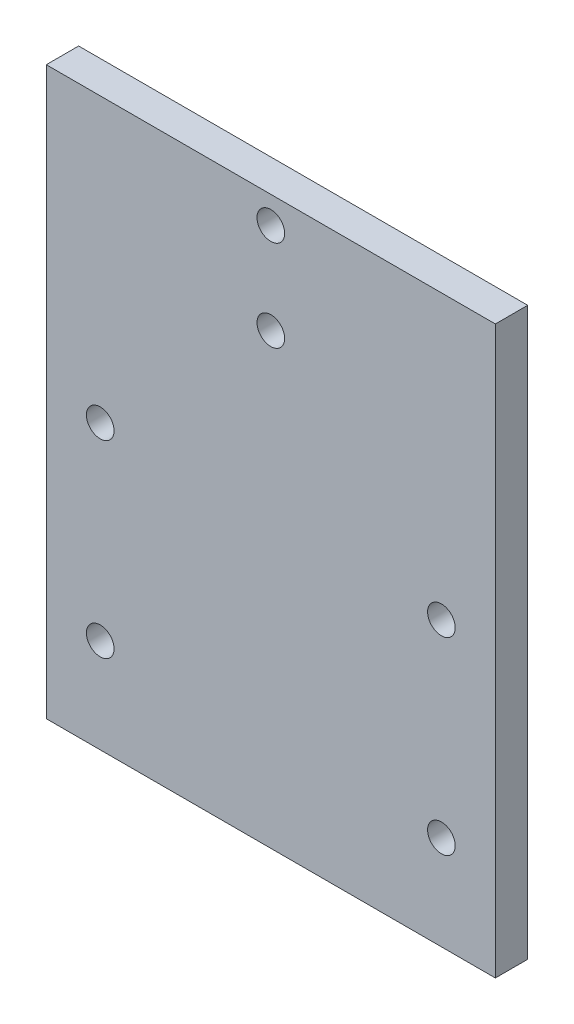
ISO-10303-21;
HEADER;
FILE_DESCRIPTION(('STEP AP214'),'2;1');
FILE_NAME('part.step','',(''),(''),'','','');
FILE_SCHEMA(('AUTOMOTIVE_DESIGN { 1 0 10303 214 1 1 1 1 }'));
ENDSEC;
DATA;
#1=APPLICATION_CONTEXT('core data for automotive mechanical design processes');
#2=APPLICATION_PROTOCOL_DEFINITION('international standard','automotive_design',2000,#1);
#3=PRODUCT_CONTEXT('',#1,'mechanical');
#4=PRODUCT('Part','Part','',(#3));
#5=PRODUCT_RELATED_PRODUCT_CATEGORY('part','',(#4));
#6=PRODUCT_DEFINITION_FORMATION('','',#4);
#7=PRODUCT_DEFINITION_CONTEXT('part definition',#1,'design');
#8=PRODUCT_DEFINITION('design','',#6,#7);
#9=PRODUCT_DEFINITION_SHAPE('','',#8);
#10=(LENGTH_UNIT() NAMED_UNIT(*) SI_UNIT(.MILLI.,.METRE.));
#11=(NAMED_UNIT(*) PLANE_ANGLE_UNIT() SI_UNIT($,.RADIAN.));
#12=(NAMED_UNIT(*) SI_UNIT($,.STERADIAN.) SOLID_ANGLE_UNIT());
#13=UNCERTAINTY_MEASURE_WITH_UNIT(LENGTH_MEASURE(1.E-05),#10,'distance_accuracy_value','');
#14=(GEOMETRIC_REPRESENTATION_CONTEXT(3) GLOBAL_UNCERTAINTY_ASSIGNED_CONTEXT((#13)) GLOBAL_UNIT_ASSIGNED_CONTEXT((#10,
#11,#12)) REPRESENTATION_CONTEXT('',''));
#15=CARTESIAN_POINT('',(0.,0.,0.));
#16=DIRECTION('',(0.,0.,1.));
#17=DIRECTION('',(1.,0.,0.));
#18=AXIS2_PLACEMENT_3D('',#15,#16,#17);
#19=CARTESIAN_POINT('',(0.,0.,0.));
#20=DIRECTION('',(0.,0.,1.));
#21=DIRECTION('',(1.,0.,0.));
#22=AXIS2_PLACEMENT_3D('',#19,#20,#21);
#23=PLANE('',#22);
#24=CARTESIAN_POINT('',(-12.65,-7.,0.));
#25=DIRECTION('',(0.,0.,-1.));
#26=DIRECTION('',(-1.,0.,0.));
#27=AXIS2_PLACEMENT_3D('',#24,#25,#26);
#28=CIRCLE('',#27,1.275);
#29=CARTESIAN_POINT('',(-13.925,-7.,0.));
#30=VERTEX_POINT('',#29);
#31=EDGE_CURVE('E190',#30,#30,#28,.T.);
#32=ORIENTED_EDGE('',*,*,#31,.F.);
#33=EDGE_LOOP('',(#32));
#34=FACE_BOUND('',#33,.T.);
#35=CARTESIAN_POINT('',(-12.65,-21.,0.));
#36=DIRECTION('',(0.,0.,-1.));
#37=DIRECTION('',(-1.,0.,0.));
#38=AXIS2_PLACEMENT_3D('',#35,#36,#37);
#39=CIRCLE('',#38,1.275);
#40=CARTESIAN_POINT('',(-13.925,-21.,0.));
#41=VERTEX_POINT('',#40);
#42=EDGE_CURVE('E181',#41,#41,#39,.T.);
#43=ORIENTED_EDGE('',*,*,#42,.F.);
#44=EDGE_LOOP('',(#43));
#45=FACE_BOUND('',#44,.T.);
#46=CARTESIAN_POINT('',(12.65,-21.,0.));
#47=DIRECTION('',(0.,0.,-1.));
#48=DIRECTION('',(-1.,0.,0.));
#49=AXIS2_PLACEMENT_3D('',#46,#47,#48);
#50=CIRCLE('',#49,1.275);
#51=CARTESIAN_POINT('',(11.375,-21.,0.));
#52=VERTEX_POINT('',#51);
#53=EDGE_CURVE('E172',#52,#52,#50,.T.);
#54=ORIENTED_EDGE('',*,*,#53,.F.);
#55=EDGE_LOOP('',(#54));
#56=FACE_BOUND('',#55,.T.);
#57=CARTESIAN_POINT('',(12.65,-7.,0.));
#58=DIRECTION('',(0.,0.,-1.));
#59=DIRECTION('',(-1.,0.,0.));
#60=AXIS2_PLACEMENT_3D('',#57,#58,#59);
#61=CIRCLE('',#60,1.275);
#62=CARTESIAN_POINT('',(11.375,-7.,0.));
#63=VERTEX_POINT('',#62);
#64=EDGE_CURVE('E163',#63,#63,#61,.T.);
#65=ORIENTED_EDGE('',*,*,#64,.F.);
#66=EDGE_LOOP('',(#65));
#67=FACE_BOUND('',#66,.T.);
#68=CARTESIAN_POINT('',(0.,5.25,0.));
#69=DIRECTION('',(0.,0.,-1.));
#70=DIRECTION('',(-1.,0.,0.));
#71=AXIS2_PLACEMENT_3D('',#68,#69,#70);
#72=CIRCLE('',#71,1.275);
#73=CARTESIAN_POINT('',(-1.275,5.25,0.));
#74=VERTEX_POINT('',#73);
#75=EDGE_CURVE('E154',#74,#74,#72,.T.);
#76=ORIENTED_EDGE('',*,*,#75,.F.);
#77=EDGE_LOOP('',(#76));
#78=FACE_BOUND('',#77,.T.);
#79=DIRECTION('',(1.,0.,0.));
#80=VECTOR('',#79,1.);
#81=CARTESIAN_POINT('',(0.,-28.,0.));
#82=LINE('',#81,#80);
#83=CARTESIAN_POINT('',(-16.65,-28.,0.));
#84=VERTEX_POINT('',#83);
#85=CARTESIAN_POINT('',(16.65,-28.,0.));
#86=VERTEX_POINT('',#85);
#87=EDGE_CURVE('E128',#84,#86,#82,.T.);
#88=ORIENTED_EDGE('',*,*,#87,.F.);
#89=DIRECTION('',(0.,1.,0.));
#90=VECTOR('',#89,1.);
#91=CARTESIAN_POINT('',(-16.65,0.,0.));
#92=LINE('',#91,#90);
#93=CARTESIAN_POINT('',(-16.65,14.,0.));
#94=VERTEX_POINT('',#93);
#95=EDGE_CURVE('E134',#84,#94,#92,.T.);
#96=ORIENTED_EDGE('',*,*,#95,.T.);
#97=DIRECTION('',(1.,0.,0.));
#98=VECTOR('',#97,1.);
#99=CARTESIAN_POINT('',(0.,14.,0.));
#100=LINE('',#99,#98);
#101=CARTESIAN_POINT('',(16.65,14.,0.));
#102=VERTEX_POINT('',#101);
#103=EDGE_CURVE('E132',#94,#102,#100,.T.);
#104=ORIENTED_EDGE('',*,*,#103,.T.);
#105=DIRECTION('',(0.,1.,0.));
#106=VECTOR('',#105,1.);
#107=CARTESIAN_POINT('',(16.65,0.,0.));
#108=LINE('',#107,#106);
#109=EDGE_CURVE('E119',#86,#102,#108,.T.);
#110=ORIENTED_EDGE('',*,*,#109,.F.);
#111=EDGE_LOOP('',(#88,#96,#104,#110));
#112=FACE_BOUND('',#111,.T.);
#113=CARTESIAN_POINT('',(0.,12.,0.));
#114=DIRECTION('',(0.,0.,-1.));
#115=DIRECTION('',(-1.,0.,0.));
#116=AXIS2_PLACEMENT_3D('',#113,#114,#115);
#117=CIRCLE('',#116,1.275);
#118=CARTESIAN_POINT('',(-1.275,12.,0.));
#119=VERTEX_POINT('',#118);
#120=EDGE_CURVE('E145',#119,#119,#117,.T.);
#121=ORIENTED_EDGE('',*,*,#120,.F.);
#122=EDGE_LOOP('',(#121));
#123=FACE_BOUND('',#122,.T.);
#124=ADVANCED_FACE('F64',(#34,#45,#56,#67,#78,#112,#123),#23,.F.);
#125=CARTESIAN_POINT('',(16.65,0.,2.4));
#126=DIRECTION('',(-1.,0.,0.));
#127=DIRECTION('',(0.,0.,1.));
#128=AXIS2_PLACEMENT_3D('',#125,#126,#127);
#129=PLANE('',#128);
#130=ORIENTED_EDGE('',*,*,#109,.T.);
#131=DIRECTION('',(0.,0.,-1.));
#132=VECTOR('',#131,1.);
#133=CARTESIAN_POINT('',(16.65,14.,2.4));
#134=LINE('',#133,#132);
#135=CARTESIAN_POINT('',(16.65,14.,2.4));
#136=VERTEX_POINT('',#135);
#137=EDGE_CURVE('E73',#136,#102,#134,.T.);
#138=ORIENTED_EDGE('',*,*,#137,.F.);
#139=DIRECTION('',(0.,1.,0.));
#140=VECTOR('',#139,1.);
#141=CARTESIAN_POINT('',(16.65,0.,2.4));
#142=LINE('',#141,#140);
#143=CARTESIAN_POINT('',(16.65,-28.,2.4));
#144=VERTEX_POINT('',#143);
#145=EDGE_CURVE('E106',#144,#136,#142,.T.);
#146=ORIENTED_EDGE('',*,*,#145,.F.);
#147=DIRECTION('',(0.,0.,-1.));
#148=VECTOR('',#147,1.);
#149=CARTESIAN_POINT('',(16.65,-28.,2.4));
#150=LINE('',#149,#148);
#151=EDGE_CURVE('E12',#144,#86,#150,.T.);
#152=ORIENTED_EDGE('',*,*,#151,.T.);
#153=EDGE_LOOP('',(#130,#138,#146,#152));
#154=FACE_BOUND('',#153,.T.);
#155=ADVANCED_FACE('F118',(#154),#129,.F.);
#156=CARTESIAN_POINT('',(0.,14.,2.4));
#157=DIRECTION('',(0.,1.,0.));
#158=DIRECTION('',(0.,0.,1.));
#159=AXIS2_PLACEMENT_3D('',#156,#157,#158);
#160=PLANE('',#159);
#161=ORIENTED_EDGE('',*,*,#103,.F.);
#162=DIRECTION('',(0.,0.,-1.));
#163=VECTOR('',#162,1.);
#164=CARTESIAN_POINT('',(-16.65,14.,2.4));
#165=LINE('',#164,#163);
#166=CARTESIAN_POINT('',(-16.65,14.,2.4));
#167=VERTEX_POINT('',#166);
#168=EDGE_CURVE('E95',#167,#94,#165,.T.);
#169=ORIENTED_EDGE('',*,*,#168,.F.);
#170=DIRECTION('',(1.,0.,0.));
#171=VECTOR('',#170,1.);
#172=CARTESIAN_POINT('',(0.,14.,2.4));
#173=LINE('',#172,#171);
#174=EDGE_CURVE('E113',#167,#136,#173,.T.);
#175=ORIENTED_EDGE('',*,*,#174,.T.);
#176=ORIENTED_EDGE('',*,*,#137,.T.);
#177=EDGE_LOOP('',(#161,#169,#175,#176));
#178=FACE_BOUND('',#177,.T.);
#179=ADVANCED_FACE('F122',(#178),#160,.T.);
#180=CARTESIAN_POINT('',(-16.65,0.,2.4));
#181=DIRECTION('',(-1.,0.,0.));
#182=DIRECTION('',(0.,0.,1.));
#183=AXIS2_PLACEMENT_3D('',#180,#181,#182);
#184=PLANE('',#183);
#185=ORIENTED_EDGE('',*,*,#95,.F.);
#186=DIRECTION('',(0.,0.,-1.));
#187=VECTOR('',#186,1.);
#188=CARTESIAN_POINT('',(-16.65,-28.,2.4));
#189=LINE('',#188,#187);
#190=CARTESIAN_POINT('',(-16.65,-28.,2.4));
#191=VERTEX_POINT('',#190);
#192=EDGE_CURVE('E81',#191,#84,#189,.T.);
#193=ORIENTED_EDGE('',*,*,#192,.F.);
#194=DIRECTION('',(0.,1.,0.));
#195=VECTOR('',#194,1.);
#196=CARTESIAN_POINT('',(-16.65,0.,2.4));
#197=LINE('',#196,#195);
#198=EDGE_CURVE('E123',#191,#167,#197,.T.);
#199=ORIENTED_EDGE('',*,*,#198,.T.);
#200=ORIENTED_EDGE('',*,*,#168,.T.);
#201=EDGE_LOOP('',(#185,#193,#199,#200));
#202=FACE_BOUND('',#201,.T.);
#203=ADVANCED_FACE('F230',(#202),#184,.T.);
#204=CARTESIAN_POINT('',(0.,-28.,2.4));
#205=DIRECTION('',(0.,1.,0.));
#206=DIRECTION('',(0.,0.,1.));
#207=AXIS2_PLACEMENT_3D('',#204,#205,#206);
#208=PLANE('',#207);
#209=ORIENTED_EDGE('',*,*,#87,.T.);
#210=ORIENTED_EDGE('',*,*,#151,.F.);
#211=DIRECTION('',(1.,0.,0.));
#212=VECTOR('',#211,1.);
#213=CARTESIAN_POINT('',(0.,-28.,2.4));
#214=LINE('',#213,#212);
#215=EDGE_CURVE('E114',#191,#144,#214,.T.);
#216=ORIENTED_EDGE('',*,*,#215,.F.);
#217=ORIENTED_EDGE('',*,*,#192,.T.);
#218=EDGE_LOOP('',(#209,#210,#216,#217));
#219=FACE_BOUND('',#218,.T.);
#220=ADVANCED_FACE('F66',(#219),#208,.F.);
#221=CARTESIAN_POINT('',(0.,0.,2.4));
#222=DIRECTION('',(0.,0.,1.));
#223=DIRECTION('',(1.,0.,0.));
#224=AXIS2_PLACEMENT_3D('',#221,#222,#223);
#225=PLANE('',#224);
#226=CARTESIAN_POINT('',(-12.65,-7.,2.4));
#227=DIRECTION('',(0.,0.,1.));
#228=DIRECTION('',(1.,0.,0.));
#229=AXIS2_PLACEMENT_3D('',#226,#227,#228);
#230=CIRCLE('',#229,1.025);
#231=CARTESIAN_POINT('',(-11.625,-7.,2.4));
#232=VERTEX_POINT('',#231);
#233=EDGE_CURVE('E184',#232,#232,#230,.T.);
#234=ORIENTED_EDGE('',*,*,#233,.F.);
#235=EDGE_LOOP('',(#234));
#236=FACE_BOUND('',#235,.T.);
#237=CARTESIAN_POINT('',(-12.65,-21.,2.4));
#238=DIRECTION('',(0.,0.,1.));
#239=DIRECTION('',(1.,0.,0.));
#240=AXIS2_PLACEMENT_3D('',#237,#238,#239);
#241=CIRCLE('',#240,1.025);
#242=CARTESIAN_POINT('',(-11.625,-21.,2.4));
#243=VERTEX_POINT('',#242);
#244=EDGE_CURVE('E175',#243,#243,#241,.T.);
#245=ORIENTED_EDGE('',*,*,#244,.F.);
#246=EDGE_LOOP('',(#245));
#247=FACE_BOUND('',#246,.T.);
#248=CARTESIAN_POINT('',(12.65,-21.,2.4));
#249=DIRECTION('',(0.,0.,1.));
#250=DIRECTION('',(1.,0.,0.));
#251=AXIS2_PLACEMENT_3D('',#248,#249,#250);
#252=CIRCLE('',#251,1.025);
#253=CARTESIAN_POINT('',(13.675,-21.,2.4));
#254=VERTEX_POINT('',#253);
#255=EDGE_CURVE('E166',#254,#254,#252,.T.);
#256=ORIENTED_EDGE('',*,*,#255,.F.);
#257=EDGE_LOOP('',(#256));
#258=FACE_BOUND('',#257,.T.);
#259=CARTESIAN_POINT('',(12.65,-7.,2.4));
#260=DIRECTION('',(0.,0.,1.));
#261=DIRECTION('',(1.,0.,0.));
#262=AXIS2_PLACEMENT_3D('',#259,#260,#261);
#263=CIRCLE('',#262,1.025);
#264=CARTESIAN_POINT('',(13.675,-7.,2.4));
#265=VERTEX_POINT('',#264);
#266=EDGE_CURVE('E157',#265,#265,#263,.T.);
#267=ORIENTED_EDGE('',*,*,#266,.F.);
#268=EDGE_LOOP('',(#267));
#269=FACE_BOUND('',#268,.T.);
#270=CARTESIAN_POINT('',(0.,5.25,2.4));
#271=DIRECTION('',(0.,0.,1.));
#272=DIRECTION('',(1.,0.,0.));
#273=AXIS2_PLACEMENT_3D('',#270,#271,#272);
#274=CIRCLE('',#273,1.025);
#275=CARTESIAN_POINT('',(1.025,5.25,2.4));
#276=VERTEX_POINT('',#275);
#277=EDGE_CURVE('E148',#276,#276,#274,.T.);
#278=ORIENTED_EDGE('',*,*,#277,.F.);
#279=EDGE_LOOP('',(#278));
#280=FACE_BOUND('',#279,.T.);
#281=CARTESIAN_POINT('',(0.,12.,2.4));
#282=DIRECTION('',(0.,0.,1.));
#283=DIRECTION('',(1.,0.,0.));
#284=AXIS2_PLACEMENT_3D('',#281,#282,#283);
#285=CIRCLE('',#284,1.025);
#286=CARTESIAN_POINT('',(1.025,12.,2.4));
#287=VERTEX_POINT('',#286);
#288=EDGE_CURVE('E130',#287,#287,#285,.T.);
#289=ORIENTED_EDGE('',*,*,#288,.F.);
#290=EDGE_LOOP('',(#289));
#291=FACE_BOUND('',#290,.T.);
#292=ORIENTED_EDGE('',*,*,#215,.T.);
#293=ORIENTED_EDGE('',*,*,#145,.T.);
#294=ORIENTED_EDGE('',*,*,#174,.F.);
#295=ORIENTED_EDGE('',*,*,#198,.F.);
#296=EDGE_LOOP('',(#292,#293,#294,#295));
#297=FACE_BOUND('',#296,.T.);
#298=ADVANCED_FACE('F110',(#236,#247,#258,#269,#280,#291,#297),#225,.T.);
#299=CARTESIAN_POINT('',(0.,12.,0.));
#300=DIRECTION('',(0.,0.,-1.));
#301=DIRECTION('',(-1.,0.,0.));
#302=AXIS2_PLACEMENT_3D('',#299,#300,#301);
#303=CYLINDRICAL_SURFACE('',#302,1.025);
#304=CARTESIAN_POINT('',(0.,12.,0.250000000000002));
#305=DIRECTION('',(0.,0.,-1.));
#306=DIRECTION('',(-1.,0.,0.));
#307=AXIS2_PLACEMENT_3D('',#304,#305,#306);
#308=CIRCLE('',#307,1.025);
#309=CARTESIAN_POINT('',(-1.025,12.,0.250000000000002));
#310=VERTEX_POINT('',#309);
#311=EDGE_CURVE('E142',#310,#310,#308,.T.);
#312=ORIENTED_EDGE('',*,*,#311,.T.);
#313=EDGE_LOOP('',(#312));
#314=FACE_BOUND('',#313,.T.);
#315=ORIENTED_EDGE('',*,*,#288,.T.);
#316=EDGE_LOOP('',(#315));
#317=FACE_BOUND('',#316,.T.);
#318=ADVANCED_FACE('F212',(#314,#317),#303,.F.);
#319=CARTESIAN_POINT('',(0.,12.,0.));
#320=DIRECTION('',(0.,0.,-1.));
#321=DIRECTION('',(-1.,0.,0.));
#322=AXIS2_PLACEMENT_3D('',#319,#320,#321);
#323=CONICAL_SURFACE('',#322,1.275,0.785398163397447);
#324=ORIENTED_EDGE('',*,*,#311,.F.);
#325=EDGE_LOOP('',(#324));
#326=FACE_BOUND('',#325,.T.);
#327=ORIENTED_EDGE('',*,*,#120,.T.);
#328=EDGE_LOOP('',(#327));
#329=FACE_BOUND('',#328,.T.);
#330=ADVANCED_FACE('F209',(#326,#329),#323,.F.);
#331=CARTESIAN_POINT('',(0.,5.25,0.));
#332=DIRECTION('',(0.,0.,-1.));
#333=DIRECTION('',(-1.,0.,0.));
#334=AXIS2_PLACEMENT_3D('',#331,#332,#333);
#335=CYLINDRICAL_SURFACE('',#334,1.025);
#336=CARTESIAN_POINT('',(0.,5.25,0.250000000000002));
#337=DIRECTION('',(0.,0.,-1.));
#338=DIRECTION('',(-1.,0.,0.));
#339=AXIS2_PLACEMENT_3D('',#336,#337,#338);
#340=CIRCLE('',#339,1.025);
#341=CARTESIAN_POINT('',(-1.025,5.25,0.250000000000002));
#342=VERTEX_POINT('',#341);
#343=EDGE_CURVE('E151',#342,#342,#340,.T.);
#344=ORIENTED_EDGE('',*,*,#343,.T.);
#345=EDGE_LOOP('',(#344));
#346=FACE_BOUND('',#345,.T.);
#347=ORIENTED_EDGE('',*,*,#277,.T.);
#348=EDGE_LOOP('',(#347));
#349=FACE_BOUND('',#348,.T.);
#350=ADVANCED_FACE('F211',(#346,#349),#335,.F.);
#351=CARTESIAN_POINT('',(0.,5.25,0.));
#352=DIRECTION('',(0.,0.,-1.));
#353=DIRECTION('',(-1.,0.,0.));
#354=AXIS2_PLACEMENT_3D('',#351,#352,#353);
#355=CONICAL_SURFACE('',#354,1.275,0.785398163397447);
#356=ORIENTED_EDGE('',*,*,#343,.F.);
#357=EDGE_LOOP('',(#356));
#358=FACE_BOUND('',#357,.T.);
#359=ORIENTED_EDGE('',*,*,#75,.T.);
#360=EDGE_LOOP('',(#359));
#361=FACE_BOUND('',#360,.T.);
#362=ADVANCED_FACE('F219',(#358,#361),#355,.F.);
#363=CARTESIAN_POINT('',(12.65,-7.,0.));
#364=DIRECTION('',(0.,0.,-1.));
#365=DIRECTION('',(-1.,0.,0.));
#366=AXIS2_PLACEMENT_3D('',#363,#364,#365);
#367=CYLINDRICAL_SURFACE('',#366,1.025);
#368=CARTESIAN_POINT('',(12.65,-7.,0.250000000000002));
#369=DIRECTION('',(0.,0.,-1.));
#370=DIRECTION('',(-1.,0.,0.));
#371=AXIS2_PLACEMENT_3D('',#368,#369,#370);
#372=CIRCLE('',#371,1.025);
#373=CARTESIAN_POINT('',(11.625,-7.,0.250000000000002));
#374=VERTEX_POINT('',#373);
#375=EDGE_CURVE('E160',#374,#374,#372,.T.);
#376=ORIENTED_EDGE('',*,*,#375,.T.);
#377=EDGE_LOOP('',(#376));
#378=FACE_BOUND('',#377,.T.);
#379=ORIENTED_EDGE('',*,*,#266,.T.);
#380=EDGE_LOOP('',(#379));
#381=FACE_BOUND('',#380,.T.);
#382=ADVANCED_FACE('F302',(#378,#381),#367,.F.);
#383=CARTESIAN_POINT('',(12.65,-7.,0.));
#384=DIRECTION('',(0.,0.,-1.));
#385=DIRECTION('',(-1.,0.,0.));
#386=AXIS2_PLACEMENT_3D('',#383,#384,#385);
#387=CONICAL_SURFACE('',#386,1.275,0.785398163397448);
#388=ORIENTED_EDGE('',*,*,#375,.F.);
#389=EDGE_LOOP('',(#388));
#390=FACE_BOUND('',#389,.T.);
#391=ORIENTED_EDGE('',*,*,#64,.T.);
#392=EDGE_LOOP('',(#391));
#393=FACE_BOUND('',#392,.T.);
#394=ADVANCED_FACE('F294',(#390,#393),#387,.F.);
#395=CARTESIAN_POINT('',(12.65,-21.,0.));
#396=DIRECTION('',(0.,0.,-1.));
#397=DIRECTION('',(-1.,0.,0.));
#398=AXIS2_PLACEMENT_3D('',#395,#396,#397);
#399=CYLINDRICAL_SURFACE('',#398,1.025);
#400=CARTESIAN_POINT('',(12.65,-21.,0.250000000000002));
#401=DIRECTION('',(0.,0.,-1.));
#402=DIRECTION('',(-1.,0.,0.));
#403=AXIS2_PLACEMENT_3D('',#400,#401,#402);
#404=CIRCLE('',#403,1.025);
#405=CARTESIAN_POINT('',(11.625,-21.,0.250000000000002));
#406=VERTEX_POINT('',#405);
#407=EDGE_CURVE('E169',#406,#406,#404,.T.);
#408=ORIENTED_EDGE('',*,*,#407,.T.);
#409=EDGE_LOOP('',(#408));
#410=FACE_BOUND('',#409,.T.);
#411=ORIENTED_EDGE('',*,*,#255,.T.);
#412=EDGE_LOOP('',(#411));
#413=FACE_BOUND('',#412,.T.);
#414=ADVANCED_FACE('F289',(#410,#413),#399,.F.);
#415=CARTESIAN_POINT('',(12.65,-21.,0.));
#416=DIRECTION('',(0.,0.,-1.));
#417=DIRECTION('',(-1.,0.,0.));
#418=AXIS2_PLACEMENT_3D('',#415,#416,#417);
#419=CONICAL_SURFACE('',#418,1.275,0.785398163397448);
#420=ORIENTED_EDGE('',*,*,#407,.F.);
#421=EDGE_LOOP('',(#420));
#422=FACE_BOUND('',#421,.T.);
#423=ORIENTED_EDGE('',*,*,#53,.T.);
#424=EDGE_LOOP('',(#423));
#425=FACE_BOUND('',#424,.T.);
#426=ADVANCED_FACE('F279',(#422,#425),#419,.F.);
#427=CARTESIAN_POINT('',(-12.65,-21.,0.));
#428=DIRECTION('',(0.,0.,-1.));
#429=DIRECTION('',(-1.,0.,0.));
#430=AXIS2_PLACEMENT_3D('',#427,#428,#429);
#431=CYLINDRICAL_SURFACE('',#430,1.025);
#432=CARTESIAN_POINT('',(-12.65,-21.,0.250000000000002));
#433=DIRECTION('',(0.,0.,-1.));
#434=DIRECTION('',(-1.,0.,0.));
#435=AXIS2_PLACEMENT_3D('',#432,#433,#434);
#436=CIRCLE('',#435,1.025);
#437=CARTESIAN_POINT('',(-13.675,-21.,0.250000000000002));
#438=VERTEX_POINT('',#437);
#439=EDGE_CURVE('E178',#438,#438,#436,.T.);
#440=ORIENTED_EDGE('',*,*,#439,.T.);
#441=EDGE_LOOP('',(#440));
#442=FACE_BOUND('',#441,.T.);
#443=ORIENTED_EDGE('',*,*,#244,.T.);
#444=EDGE_LOOP('',(#443));
#445=FACE_BOUND('',#444,.T.);
#446=ADVANCED_FACE('F273',(#442,#445),#431,.F.);
#447=CARTESIAN_POINT('',(-12.65,-21.,0.));
#448=DIRECTION('',(0.,0.,-1.));
#449=DIRECTION('',(-1.,0.,0.));
#450=AXIS2_PLACEMENT_3D('',#447,#448,#449);
#451=CONICAL_SURFACE('',#450,1.275,0.785398163397448);
#452=ORIENTED_EDGE('',*,*,#439,.F.);
#453=EDGE_LOOP('',(#452));
#454=FACE_BOUND('',#453,.T.);
#455=ORIENTED_EDGE('',*,*,#42,.T.);
#456=EDGE_LOOP('',(#455));
#457=FACE_BOUND('',#456,.T.);
#458=ADVANCED_FACE('F278',(#454,#457),#451,.F.);
#459=CARTESIAN_POINT('',(-12.65,-7.,0.));
#460=DIRECTION('',(0.,0.,-1.));
#461=DIRECTION('',(-1.,0.,0.));
#462=AXIS2_PLACEMENT_3D('',#459,#460,#461);
#463=CYLINDRICAL_SURFACE('',#462,1.025);
#464=CARTESIAN_POINT('',(-12.65,-7.,0.250000000000002));
#465=DIRECTION('',(0.,0.,-1.));
#466=DIRECTION('',(-1.,0.,0.));
#467=AXIS2_PLACEMENT_3D('',#464,#465,#466);
#468=CIRCLE('',#467,1.025);
#469=CARTESIAN_POINT('',(-13.675,-7.,0.250000000000002));
#470=VERTEX_POINT('',#469);
#471=EDGE_CURVE('E187',#470,#470,#468,.T.);
#472=ORIENTED_EDGE('',*,*,#471,.T.);
#473=EDGE_LOOP('',(#472));
#474=FACE_BOUND('',#473,.T.);
#475=ORIENTED_EDGE('',*,*,#233,.T.);
#476=EDGE_LOOP('',(#475));
#477=FACE_BOUND('',#476,.T.);
#478=ADVANCED_FACE('F312',(#474,#477),#463,.F.);
#479=CARTESIAN_POINT('',(-12.65,-7.,0.));
#480=DIRECTION('',(0.,0.,-1.));
#481=DIRECTION('',(-1.,0.,0.));
#482=AXIS2_PLACEMENT_3D('',#479,#480,#481);
#483=CONICAL_SURFACE('',#482,1.275,0.785398163397448);
#484=ORIENTED_EDGE('',*,*,#471,.F.);
#485=EDGE_LOOP('',(#484));
#486=FACE_BOUND('',#485,.T.);
#487=ORIENTED_EDGE('',*,*,#31,.T.);
#488=EDGE_LOOP('',(#487));
#489=FACE_BOUND('',#488,.T.);
#490=ADVANCED_FACE('F194',(#486,#489),#483,.F.);
#491=CLOSED_SHELL('',(#124,#155,#179,#203,#220,#298,#318,#330,#350,#362,#382,#394,#414,#426,
#446,#458,#478,#490));
#492=MANIFOLD_SOLID_BREP('B2',#491);
#493=ADVANCED_BREP_SHAPE_REPRESENTATION('',(#18,#492),#14);
#494=SHAPE_DEFINITION_REPRESENTATION(#9,#493);
ENDSEC;
END-ISO-10303-21;
